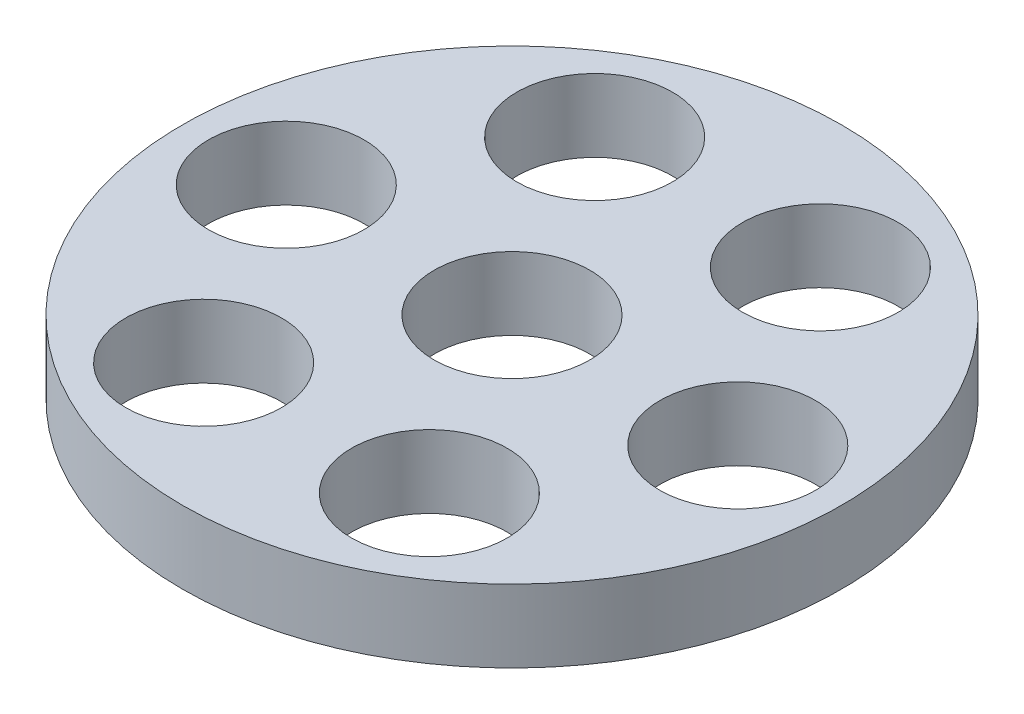
ISO-10303-21;
HEADER;
FILE_DESCRIPTION(('STEP AP214'),'2;1');
FILE_NAME('part.step','',(''),(''),'','','');
FILE_SCHEMA(('AUTOMOTIVE_DESIGN { 1 0 10303 214 1 1 1 1 }'));
ENDSEC;
DATA;
#1=APPLICATION_CONTEXT('core data for automotive mechanical design processes');
#2=APPLICATION_PROTOCOL_DEFINITION('international standard','automotive_design',2000,#1);
#3=PRODUCT_CONTEXT('',#1,'mechanical');
#4=PRODUCT('Part','Part','',(#3));
#5=PRODUCT_RELATED_PRODUCT_CATEGORY('part','',(#4));
#6=PRODUCT_DEFINITION_FORMATION('','',#4);
#7=PRODUCT_DEFINITION_CONTEXT('part definition',#1,'design');
#8=PRODUCT_DEFINITION('design','',#6,#7);
#9=PRODUCT_DEFINITION_SHAPE('','',#8);
#10=(LENGTH_UNIT() NAMED_UNIT(*) SI_UNIT(.MILLI.,.METRE.));
#11=(NAMED_UNIT(*) PLANE_ANGLE_UNIT() SI_UNIT($,.RADIAN.));
#12=(NAMED_UNIT(*) SI_UNIT($,.STERADIAN.) SOLID_ANGLE_UNIT());
#13=UNCERTAINTY_MEASURE_WITH_UNIT(LENGTH_MEASURE(1.E-05),#10,'distance_accuracy_value','');
#14=(GEOMETRIC_REPRESENTATION_CONTEXT(3) GLOBAL_UNCERTAINTY_ASSIGNED_CONTEXT((#13)) GLOBAL_UNIT_ASSIGNED_CONTEXT((#10,
#11,#12)) REPRESENTATION_CONTEXT('',''));
#15=CARTESIAN_POINT('',(0.,0.,0.));
#16=DIRECTION('',(0.,0.,1.));
#17=DIRECTION('',(1.,0.,0.));
#18=AXIS2_PLACEMENT_3D('',#15,#16,#17);
#19=CARTESIAN_POINT('',(0.,-7.,0.));
#20=DIRECTION('',(0.,1.,0.));
#21=DIRECTION('',(0.,0.,1.));
#22=AXIS2_PLACEMENT_3D('',#19,#20,#21);
#23=CYLINDRICAL_SURFACE('',#22,31.75);
#24=CARTESIAN_POINT('',(0.,-7.,0.));
#25=DIRECTION('',(0.,1.,0.));
#26=DIRECTION('',(0.,0.,1.));
#27=AXIS2_PLACEMENT_3D('',#24,#25,#26);
#28=CIRCLE('',#27,31.75);
#29=CARTESIAN_POINT('',(0.,-7.,31.75));
#30=VERTEX_POINT('',#29);
#31=EDGE_CURVE('E10',#30,#30,#28,.T.);
#32=ORIENTED_EDGE('',*,*,#31,.T.);
#33=EDGE_LOOP('',(#32));
#34=FACE_BOUND('',#33,.T.);
#35=CARTESIAN_POINT('',(0.,0.,0.));
#36=DIRECTION('',(0.,1.,0.));
#37=DIRECTION('',(0.,0.,1.));
#38=AXIS2_PLACEMENT_3D('',#35,#36,#37);
#39=CIRCLE('',#38,31.75);
#40=CARTESIAN_POINT('',(0.,0.,31.75));
#41=VERTEX_POINT('',#40);
#42=EDGE_CURVE('E36',#41,#41,#39,.T.);
#43=ORIENTED_EDGE('',*,*,#42,.F.);
#44=EDGE_LOOP('',(#43));
#45=FACE_BOUND('',#44,.T.);
#46=ADVANCED_FACE('F33',(#34,#45),#23,.T.);
#47=CARTESIAN_POINT('',(0.,-7.,0.));
#48=DIRECTION('',(0.,1.,0.));
#49=DIRECTION('',(0.,0.,1.));
#50=AXIS2_PLACEMENT_3D('',#47,#48,#49);
#51=PLANE('',#50);
#52=CARTESIAN_POINT('',(-10.8734999999998,-7.,-18.8351865069079));
#53=DIRECTION('',(0.,1.,0.));
#54=DIRECTION('',(0.,0.,1.));
#55=AXIS2_PLACEMENT_3D('',#52,#53,#54);
#56=CIRCLE('',#55,7.5);
#57=CARTESIAN_POINT('',(-10.8734999999998,-7.,-11.3351865069079));
#58=VERTEX_POINT('',#57);
#59=EDGE_CURVE('E43',#58,#58,#56,.T.);
#60=ORIENTED_EDGE('',*,*,#59,.T.);
#61=EDGE_LOOP('',(#60));
#62=FACE_BOUND('',#61,.T.);
#63=CARTESIAN_POINT('',(10.8755000000002,-7.,-18.8351865069076));
#64=DIRECTION('',(0.,1.,0.));
#65=DIRECTION('',(0.,0.,1.));
#66=AXIS2_PLACEMENT_3D('',#63,#64,#65);
#67=CIRCLE('',#66,7.49999999999999);
#68=CARTESIAN_POINT('',(10.8755000000002,-7.,-11.3351865069076));
#69=VERTEX_POINT('',#68);
#70=EDGE_CURVE('E47',#69,#69,#67,.T.);
#71=ORIENTED_EDGE('',*,*,#70,.T.);
#72=EDGE_LOOP('',(#71));
#73=FACE_BOUND('',#72,.T.);
#74=CARTESIAN_POINT('',(21.75,-7.,0.));
#75=DIRECTION('',(0.,1.,0.));
#76=DIRECTION('',(0.,0.,1.));
#77=AXIS2_PLACEMENT_3D('',#74,#75,#76);
#78=CIRCLE('',#77,7.5);
#79=CARTESIAN_POINT('',(21.75,-7.,7.5));
#80=VERTEX_POINT('',#79);
#81=EDGE_CURVE('E50',#80,#80,#78,.T.);
#82=ORIENTED_EDGE('',*,*,#81,.T.);
#83=EDGE_LOOP('',(#82));
#84=FACE_BOUND('',#83,.T.);
#85=CARTESIAN_POINT('',(10.8755,-7.,18.8351865069078));
#86=DIRECTION('',(0.,1.,0.));
#87=DIRECTION('',(0.,0.,1.));
#88=AXIS2_PLACEMENT_3D('',#85,#86,#87);
#89=CIRCLE('',#88,7.5);
#90=CARTESIAN_POINT('',(10.8755,-7.,26.3351865069078));
#91=VERTEX_POINT('',#90);
#92=EDGE_CURVE('E53',#91,#91,#89,.T.);
#93=ORIENTED_EDGE('',*,*,#92,.T.);
#94=EDGE_LOOP('',(#93));
#95=FACE_BOUND('',#94,.T.);
#96=CARTESIAN_POINT('',(-10.8735000000001,-7.,18.8351865069077));
#97=DIRECTION('',(0.,1.,0.));
#98=DIRECTION('',(0.,0.,1.));
#99=AXIS2_PLACEMENT_3D('',#96,#97,#98);
#100=CIRCLE('',#99,7.5);
#101=CARTESIAN_POINT('',(-10.8735000000001,-7.,26.3351865069077));
#102=VERTEX_POINT('',#101);
#103=EDGE_CURVE('E56',#102,#102,#100,.T.);
#104=ORIENTED_EDGE('',*,*,#103,.T.);
#105=EDGE_LOOP('',(#104));
#106=FACE_BOUND('',#105,.T.);
#107=CARTESIAN_POINT('',(0.00149999999999999,-7.,0.000866025403784443));
#108=DIRECTION('',(0.,1.,0.));
#109=DIRECTION('',(0.,0.,1.));
#110=AXIS2_PLACEMENT_3D('',#107,#108,#109);
#111=CIRCLE('',#110,7.5);
#112=CARTESIAN_POINT('',(0.00149999999999999,-7.,7.50086602540378));
#113=VERTEX_POINT('',#112);
#114=EDGE_CURVE('E59',#113,#113,#111,.T.);
#115=ORIENTED_EDGE('',*,*,#114,.T.);
#116=EDGE_LOOP('',(#115));
#117=FACE_BOUND('',#116,.T.);
#118=CARTESIAN_POINT('',(-21.748,-7.,-1.51872455276999E-13));
#119=DIRECTION('',(0.,1.,0.));
#120=DIRECTION('',(0.,0.,1.));
#121=AXIS2_PLACEMENT_3D('',#118,#119,#120);
#122=CIRCLE('',#121,7.5);
#123=CARTESIAN_POINT('',(-21.748,-7.,7.49999999999985));
#124=VERTEX_POINT('',#123);
#125=EDGE_CURVE('E62',#124,#124,#122,.T.);
#126=ORIENTED_EDGE('',*,*,#125,.T.);
#127=EDGE_LOOP('',(#126));
#128=FACE_BOUND('',#127,.T.);
#129=ORIENTED_EDGE('',*,*,#31,.F.);
#130=EDGE_LOOP('',(#129));
#131=FACE_BOUND('',#130,.T.);
#132=ADVANCED_FACE('F94',(#62,#73,#84,#95,#106,#117,#128,#131),#51,.F.);
#133=CARTESIAN_POINT('',(0.,0.,0.));
#134=DIRECTION('',(0.,1.,0.));
#135=DIRECTION('',(0.,0.,1.));
#136=AXIS2_PLACEMENT_3D('',#133,#134,#135);
#137=PLANE('',#136);
#138=CARTESIAN_POINT('',(-10.8734999999998,0.,-18.8351865069079));
#139=DIRECTION('',(0.,1.,0.));
#140=DIRECTION('',(0.,0.,1.));
#141=AXIS2_PLACEMENT_3D('',#138,#139,#140);
#142=CIRCLE('',#141,7.5);
#143=CARTESIAN_POINT('',(-10.8734999999998,0.,-11.3351865069079));
#144=VERTEX_POINT('',#143);
#145=EDGE_CURVE('E68',#144,#144,#142,.T.);
#146=ORIENTED_EDGE('',*,*,#145,.F.);
#147=EDGE_LOOP('',(#146));
#148=FACE_BOUND('',#147,.T.);
#149=CARTESIAN_POINT('',(10.8755000000002,0.,-18.8351865069076));
#150=DIRECTION('',(0.,1.,0.));
#151=DIRECTION('',(0.,0.,1.));
#152=AXIS2_PLACEMENT_3D('',#149,#150,#151);
#153=CIRCLE('',#152,7.49999999999999);
#154=CARTESIAN_POINT('',(10.8755000000002,0.,-11.3351865069076));
#155=VERTEX_POINT('',#154);
#156=EDGE_CURVE('E76',#155,#155,#153,.T.);
#157=ORIENTED_EDGE('',*,*,#156,.F.);
#158=EDGE_LOOP('',(#157));
#159=FACE_BOUND('',#158,.T.);
#160=CARTESIAN_POINT('',(21.75,0.,0.));
#161=DIRECTION('',(0.,1.,0.));
#162=DIRECTION('',(0.,0.,1.));
#163=AXIS2_PLACEMENT_3D('',#160,#161,#162);
#164=CIRCLE('',#163,7.5);
#165=CARTESIAN_POINT('',(21.75,0.,7.5));
#166=VERTEX_POINT('',#165);
#167=EDGE_CURVE('E72',#166,#166,#164,.T.);
#168=ORIENTED_EDGE('',*,*,#167,.F.);
#169=EDGE_LOOP('',(#168));
#170=FACE_BOUND('',#169,.T.);
#171=CARTESIAN_POINT('',(10.8755,0.,18.8351865069078));
#172=DIRECTION('',(0.,1.,0.));
#173=DIRECTION('',(0.,0.,1.));
#174=AXIS2_PLACEMENT_3D('',#171,#172,#173);
#175=CIRCLE('',#174,7.5);
#176=CARTESIAN_POINT('',(10.8755,0.,26.3351865069078));
#177=VERTEX_POINT('',#176);
#178=EDGE_CURVE('E69',#177,#177,#175,.T.);
#179=ORIENTED_EDGE('',*,*,#178,.F.);
#180=EDGE_LOOP('',(#179));
#181=FACE_BOUND('',#180,.T.);
#182=CARTESIAN_POINT('',(-10.8735000000001,0.,18.8351865069077));
#183=DIRECTION('',(0.,1.,0.));
#184=DIRECTION('',(0.,0.,1.));
#185=AXIS2_PLACEMENT_3D('',#182,#183,#184);
#186=CIRCLE('',#185,7.5);
#187=CARTESIAN_POINT('',(-10.8735000000001,0.,26.3351865069077));
#188=VERTEX_POINT('',#187);
#189=EDGE_CURVE('E73',#188,#188,#186,.T.);
#190=ORIENTED_EDGE('',*,*,#189,.F.);
#191=EDGE_LOOP('',(#190));
#192=FACE_BOUND('',#191,.T.);
#193=CARTESIAN_POINT('',(0.00149999999999999,0.,0.000866025403784443));
#194=DIRECTION('',(0.,1.,0.));
#195=DIRECTION('',(0.,0.,1.));
#196=AXIS2_PLACEMENT_3D('',#193,#194,#195);
#197=CIRCLE('',#196,7.5);
#198=CARTESIAN_POINT('',(0.00149999999999999,0.,7.50086602540378));
#199=VERTEX_POINT('',#198);
#200=EDGE_CURVE('E81',#199,#199,#197,.T.);
#201=ORIENTED_EDGE('',*,*,#200,.F.);
#202=EDGE_LOOP('',(#201));
#203=FACE_BOUND('',#202,.T.);
#204=CARTESIAN_POINT('',(-21.748,0.,-1.51872455276999E-13));
#205=DIRECTION('',(0.,1.,0.));
#206=DIRECTION('',(0.,0.,1.));
#207=AXIS2_PLACEMENT_3D('',#204,#205,#206);
#208=CIRCLE('',#207,7.5);
#209=CARTESIAN_POINT('',(-21.748,0.,7.49999999999985));
#210=VERTEX_POINT('',#209);
#211=EDGE_CURVE('E65',#210,#210,#208,.T.);
#212=ORIENTED_EDGE('',*,*,#211,.F.);
#213=EDGE_LOOP('',(#212));
#214=FACE_BOUND('',#213,.T.);
#215=ORIENTED_EDGE('',*,*,#42,.T.);
#216=EDGE_LOOP('',(#215));
#217=FACE_BOUND('',#216,.T.);
#218=ADVANCED_FACE('F90',(#148,#159,#170,#181,#192,#203,#214,#217),#137,.T.);
#219=CARTESIAN_POINT('',(-21.748,-10.,-1.51872455276999E-13));
#220=DIRECTION('',(0.,1.,0.));
#221=DIRECTION('',(0.,0.,1.));
#222=AXIS2_PLACEMENT_3D('',#219,#220,#221);
#223=CYLINDRICAL_SURFACE('',#222,7.5);
#224=ORIENTED_EDGE('',*,*,#211,.T.);
#225=EDGE_LOOP('',(#224));
#226=FACE_BOUND('',#225,.T.);
#227=ORIENTED_EDGE('',*,*,#125,.F.);
#228=EDGE_LOOP('',(#227));
#229=FACE_BOUND('',#228,.T.);
#230=ADVANCED_FACE('F93',(#226,#229),#223,.F.);
#231=CARTESIAN_POINT('',(0.00149999999999999,-10.,0.000866025403784443));
#232=DIRECTION('',(0.,1.,0.));
#233=DIRECTION('',(0.,0.,1.));
#234=AXIS2_PLACEMENT_3D('',#231,#232,#233);
#235=CYLINDRICAL_SURFACE('',#234,7.5);
#236=ORIENTED_EDGE('',*,*,#200,.T.);
#237=EDGE_LOOP('',(#236));
#238=FACE_BOUND('',#237,.T.);
#239=ORIENTED_EDGE('',*,*,#114,.F.);
#240=EDGE_LOOP('',(#239));
#241=FACE_BOUND('',#240,.T.);
#242=ADVANCED_FACE('F114',(#238,#241),#235,.F.);
#243=CARTESIAN_POINT('',(-10.8735000000001,-10.,18.8351865069077));
#244=DIRECTION('',(0.,1.,0.));
#245=DIRECTION('',(0.,0.,1.));
#246=AXIS2_PLACEMENT_3D('',#243,#244,#245);
#247=CYLINDRICAL_SURFACE('',#246,7.5);
#248=ORIENTED_EDGE('',*,*,#189,.T.);
#249=EDGE_LOOP('',(#248));
#250=FACE_BOUND('',#249,.T.);
#251=ORIENTED_EDGE('',*,*,#103,.F.);
#252=EDGE_LOOP('',(#251));
#253=FACE_BOUND('',#252,.T.);
#254=ADVANCED_FACE('F87',(#250,#253),#247,.F.);
#255=CARTESIAN_POINT('',(10.8755,-10.,18.8351865069078));
#256=DIRECTION('',(0.,1.,0.));
#257=DIRECTION('',(0.,0.,1.));
#258=AXIS2_PLACEMENT_3D('',#255,#256,#257);
#259=CYLINDRICAL_SURFACE('',#258,7.5);
#260=ORIENTED_EDGE('',*,*,#178,.T.);
#261=EDGE_LOOP('',(#260));
#262=FACE_BOUND('',#261,.T.);
#263=ORIENTED_EDGE('',*,*,#92,.F.);
#264=EDGE_LOOP('',(#263));
#265=FACE_BOUND('',#264,.T.);
#266=ADVANCED_FACE('F116',(#262,#265),#259,.F.);
#267=CARTESIAN_POINT('',(21.75,-10.,0.));
#268=DIRECTION('',(0.,1.,0.));
#269=DIRECTION('',(0.,0.,1.));
#270=AXIS2_PLACEMENT_3D('',#267,#268,#269);
#271=CYLINDRICAL_SURFACE('',#270,7.5);
#272=ORIENTED_EDGE('',*,*,#167,.T.);
#273=EDGE_LOOP('',(#272));
#274=FACE_BOUND('',#273,.T.);
#275=ORIENTED_EDGE('',*,*,#81,.F.);
#276=EDGE_LOOP('',(#275));
#277=FACE_BOUND('',#276,.T.);
#278=ADVANCED_FACE('F119',(#274,#277),#271,.F.);
#279=CARTESIAN_POINT('',(10.8755000000002,-10.,-18.8351865069076));
#280=DIRECTION('',(0.,1.,0.));
#281=DIRECTION('',(0.,0.,1.));
#282=AXIS2_PLACEMENT_3D('',#279,#280,#281);
#283=CYLINDRICAL_SURFACE('',#282,7.49999999999999);
#284=ORIENTED_EDGE('',*,*,#156,.T.);
#285=EDGE_LOOP('',(#284));
#286=FACE_BOUND('',#285,.T.);
#287=ORIENTED_EDGE('',*,*,#70,.F.);
#288=EDGE_LOOP('',(#287));
#289=FACE_BOUND('',#288,.T.);
#290=ADVANCED_FACE('F123',(#286,#289),#283,.F.);
#291=CARTESIAN_POINT('',(-10.8734999999998,-10.,-18.8351865069079));
#292=DIRECTION('',(0.,1.,0.));
#293=DIRECTION('',(0.,0.,1.));
#294=AXIS2_PLACEMENT_3D('',#291,#292,#293);
#295=CYLINDRICAL_SURFACE('',#294,7.5);
#296=ORIENTED_EDGE('',*,*,#145,.T.);
#297=EDGE_LOOP('',(#296));
#298=FACE_BOUND('',#297,.T.);
#299=ORIENTED_EDGE('',*,*,#59,.F.);
#300=EDGE_LOOP('',(#299));
#301=FACE_BOUND('',#300,.T.);
#302=ADVANCED_FACE('F127',(#298,#301),#295,.F.);
#303=CLOSED_SHELL('',(#46,#132,#218,#230,#242,#254,#266,#278,#290,#302));
#304=MANIFOLD_SOLID_BREP('B2',#303);
#305=ADVANCED_BREP_SHAPE_REPRESENTATION('',(#18,#304),#14);
#306=SHAPE_DEFINITION_REPRESENTATION(#9,#305);
ENDSEC;
END-ISO-10303-21;
